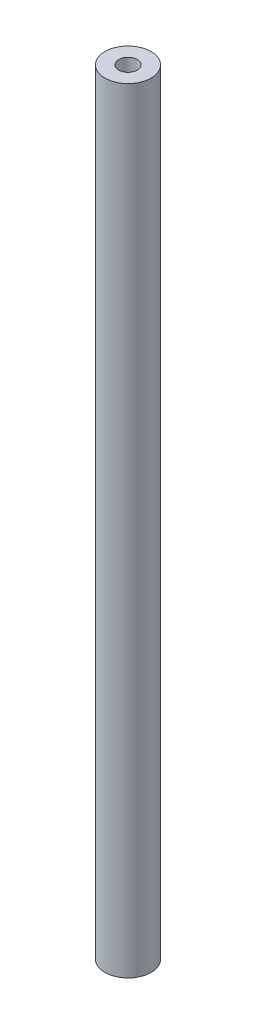
ISO-10303-21;
HEADER;
FILE_DESCRIPTION(('STEP AP214'),'2;1');
FILE_NAME('part.step','',(''),(''),'','','');
FILE_SCHEMA(('AUTOMOTIVE_DESIGN { 1 0 10303 214 1 1 1 1 }'));
ENDSEC;
DATA;
#1=APPLICATION_CONTEXT('core data for automotive mechanical design processes');
#2=APPLICATION_PROTOCOL_DEFINITION('international standard','automotive_design',2000,#1);
#3=PRODUCT_CONTEXT('',#1,'mechanical');
#4=PRODUCT('Part','Part','',(#3));
#5=PRODUCT_RELATED_PRODUCT_CATEGORY('part','',(#4));
#6=PRODUCT_DEFINITION_FORMATION('','',#4);
#7=PRODUCT_DEFINITION_CONTEXT('part definition',#1,'design');
#8=PRODUCT_DEFINITION('design','',#6,#7);
#9=PRODUCT_DEFINITION_SHAPE('','',#8);
#10=(LENGTH_UNIT() NAMED_UNIT(*) SI_UNIT(.MILLI.,.METRE.));
#11=(NAMED_UNIT(*) PLANE_ANGLE_UNIT() SI_UNIT($,.RADIAN.));
#12=(NAMED_UNIT(*) SI_UNIT($,.STERADIAN.) SOLID_ANGLE_UNIT());
#13=UNCERTAINTY_MEASURE_WITH_UNIT(LENGTH_MEASURE(1.E-05),#10,'distance_accuracy_value','');
#14=(GEOMETRIC_REPRESENTATION_CONTEXT(3) GLOBAL_UNCERTAINTY_ASSIGNED_CONTEXT((#13)) GLOBAL_UNIT_ASSIGNED_CONTEXT((#10,
#11,#12)) REPRESENTATION_CONTEXT('',''));
#15=CARTESIAN_POINT('',(0.,0.,0.));
#16=DIRECTION('',(0.,0.,1.));
#17=DIRECTION('',(1.,0.,0.));
#18=AXIS2_PLACEMENT_3D('',#15,#16,#17);
#19=CARTESIAN_POINT('',(0.,266.7,0.));
#20=DIRECTION('',(0.,1.,0.));
#21=DIRECTION('',(0.,0.,1.));
#22=AXIS2_PLACEMENT_3D('',#19,#20,#21);
#23=PLANE('',#22);
#24=CARTESIAN_POINT('',(0.,266.7,0.));
#25=DIRECTION('',(0.,1.,0.));
#26=DIRECTION('',(1.,0.,0.));
#27=AXIS2_PLACEMENT_3D('',#24,#25,#26);
#28=CIRCLE('',#27,7.9375);
#29=CARTESIAN_POINT('',(7.9375,266.7,0.));
#30=VERTEX_POINT('',#29);
#31=EDGE_CURVE('E10',#30,#30,#28,.T.);
#32=ORIENTED_EDGE('',*,*,#31,.T.);
#33=EDGE_LOOP('',(#32));
#34=FACE_BOUND('',#33,.T.);
#35=CARTESIAN_POINT('',(0.,266.7,0.));
#36=DIRECTION('',(0.,-1.,0.));
#37=DIRECTION('',(-1.,0.,0.));
#38=AXIS2_PLACEMENT_3D('',#35,#36,#37);
#39=CIRCLE('',#38,3.175);
#40=CARTESIAN_POINT('',(3.175,266.7,0.));
#41=VERTEX_POINT('',#40);
#42=EDGE_CURVE('E55',#41,#41,#39,.T.);
#43=ORIENTED_EDGE('',*,*,#42,.T.);
#44=EDGE_LOOP('',(#43));
#45=FACE_BOUND('',#44,.T.);
#46=ADVANCED_FACE('F15',(#34,#45),#23,.T.);
#47=CARTESIAN_POINT('',(0.,0.,0.));
#48=DIRECTION('',(0.,1.,0.));
#49=DIRECTION('',(0.,0.,1.));
#50=AXIS2_PLACEMENT_3D('',#47,#48,#49);
#51=PLANE('',#50);
#52=CARTESIAN_POINT('',(0.,0.,0.));
#53=DIRECTION('',(0.,-1.,0.));
#54=DIRECTION('',(1.,0.,0.));
#55=AXIS2_PLACEMENT_3D('',#52,#53,#54);
#56=CIRCLE('',#55,7.9375);
#57=CARTESIAN_POINT('',(7.9375,0.,0.));
#58=VERTEX_POINT('',#57);
#59=EDGE_CURVE('E25',#58,#58,#56,.T.);
#60=ORIENTED_EDGE('',*,*,#59,.T.);
#61=EDGE_LOOP('',(#60));
#62=FACE_BOUND('',#61,.T.);
#63=CARTESIAN_POINT('',(0.,0.,0.));
#64=DIRECTION('',(0.,1.,0.));
#65=DIRECTION('',(-1.,0.,0.));
#66=AXIS2_PLACEMENT_3D('',#63,#64,#65);
#67=CIRCLE('',#66,3.175);
#68=CARTESIAN_POINT('',(3.175,0.,0.));
#69=VERTEX_POINT('',#68);
#70=EDGE_CURVE('E64',#69,#69,#67,.T.);
#71=ORIENTED_EDGE('',*,*,#70,.T.);
#72=EDGE_LOOP('',(#71));
#73=FACE_BOUND('',#72,.T.);
#74=ADVANCED_FACE('F68',(#62,#73),#51,.F.);
#75=CARTESIAN_POINT('',(0.,0.,0.));
#76=DIRECTION('',(0.,-1.,0.));
#77=DIRECTION('',(1.,0.,0.));
#78=AXIS2_PLACEMENT_3D('',#75,#76,#77);
#79=CYLINDRICAL_SURFACE('',#78,7.9375);
#80=ORIENTED_EDGE('',*,*,#31,.F.);
#81=EDGE_LOOP('',(#80));
#82=FACE_BOUND('',#81,.T.);
#83=ORIENTED_EDGE('',*,*,#59,.F.);
#84=EDGE_LOOP('',(#83));
#85=FACE_BOUND('',#84,.T.);
#86=ADVANCED_FACE('F71',(#82,#85),#79,.T.);
#87=CARTESIAN_POINT('',(0.,0.,0.));
#88=DIRECTION('',(0.,-1.,0.));
#89=DIRECTION('',(1.,0.,0.));
#90=AXIS2_PLACEMENT_3D('',#87,#88,#89);
#91=CYLINDRICAL_SURFACE('',#90,6.2865);
#92=CARTESIAN_POINT('',(0.,254.,0.));
#93=DIRECTION('',(0.,1.,0.));
#94=DIRECTION('',(1.,0.,0.));
#95=AXIS2_PLACEMENT_3D('',#92,#93,#94);
#96=CIRCLE('',#95,6.2865);
#97=CARTESIAN_POINT('',(-6.2865,254.,0.));
#98=VERTEX_POINT('',#97);
#99=EDGE_CURVE('E59',#98,#98,#96,.T.);
#100=ORIENTED_EDGE('',*,*,#99,.T.);
#101=EDGE_LOOP('',(#100));
#102=FACE_BOUND('',#101,.T.);
#103=CARTESIAN_POINT('',(0.,12.7,0.));
#104=DIRECTION('',(0.,-1.,0.));
#105=DIRECTION('',(1.,0.,0.));
#106=AXIS2_PLACEMENT_3D('',#103,#104,#105);
#107=CIRCLE('',#106,6.2865);
#108=CARTESIAN_POINT('',(-6.2865,12.7,0.));
#109=VERTEX_POINT('',#108);
#110=EDGE_CURVE('E41',#109,#109,#107,.T.);
#111=ORIENTED_EDGE('',*,*,#110,.T.);
#112=EDGE_LOOP('',(#111));
#113=FACE_BOUND('',#112,.T.);
#114=ADVANCED_FACE('F60',(#102,#113),#91,.F.);
#115=CARTESIAN_POINT('',(0.,266.7,0.));
#116=DIRECTION('',(0.,1.,0.));
#117=DIRECTION('',(-1.,0.,0.));
#118=AXIS2_PLACEMENT_3D('',#115,#116,#117);
#119=CYLINDRICAL_SURFACE('',#118,3.175);
#120=ORIENTED_EDGE('',*,*,#42,.F.);
#121=EDGE_LOOP('',(#120));
#122=FACE_BOUND('',#121,.T.);
#123=CARTESIAN_POINT('',(0.,254.,0.));
#124=DIRECTION('',(0.,1.,0.));
#125=DIRECTION('',(-1.,0.,0.));
#126=AXIS2_PLACEMENT_3D('',#123,#124,#125);
#127=CIRCLE('',#126,3.175);
#128=CARTESIAN_POINT('',(3.175,254.,0.));
#129=VERTEX_POINT('',#128);
#130=EDGE_CURVE('E19',#129,#129,#127,.T.);
#131=ORIENTED_EDGE('',*,*,#130,.F.);
#132=EDGE_LOOP('',(#131));
#133=FACE_BOUND('',#132,.T.);
#134=ADVANCED_FACE('F80',(#122,#133),#119,.F.);
#135=CARTESIAN_POINT('',(0.,254.,0.));
#136=DIRECTION('',(0.,1.,0.));
#137=DIRECTION('',(0.,0.,1.));
#138=AXIS2_PLACEMENT_3D('',#135,#136,#137);
#139=PLANE('',#138);
#140=ORIENTED_EDGE('',*,*,#99,.F.);
#141=EDGE_LOOP('',(#140));
#142=FACE_BOUND('',#141,.T.);
#143=ORIENTED_EDGE('',*,*,#130,.T.);
#144=EDGE_LOOP('',(#143));
#145=FACE_BOUND('',#144,.T.);
#146=ADVANCED_FACE('F17',(#142,#145),#139,.F.);
#147=CARTESIAN_POINT('',(0.,0.,0.));
#148=DIRECTION('',(0.,-1.,0.));
#149=DIRECTION('',(-1.,0.,0.));
#150=AXIS2_PLACEMENT_3D('',#147,#148,#149);
#151=CYLINDRICAL_SURFACE('',#150,3.175);
#152=ORIENTED_EDGE('',*,*,#70,.F.);
#153=EDGE_LOOP('',(#152));
#154=FACE_BOUND('',#153,.T.);
#155=CARTESIAN_POINT('',(0.,12.7,0.));
#156=DIRECTION('',(0.,-1.,0.));
#157=DIRECTION('',(-1.,0.,0.));
#158=AXIS2_PLACEMENT_3D('',#155,#156,#157);
#159=CIRCLE('',#158,3.175);
#160=CARTESIAN_POINT('',(3.175,12.7,0.));
#161=VERTEX_POINT('',#160);
#162=EDGE_CURVE('E48',#161,#161,#159,.T.);
#163=ORIENTED_EDGE('',*,*,#162,.F.);
#164=EDGE_LOOP('',(#163));
#165=FACE_BOUND('',#164,.T.);
#166=ADVANCED_FACE('F88',(#154,#165),#151,.F.);
#167=CARTESIAN_POINT('',(0.,12.7,0.));
#168=DIRECTION('',(0.,1.,0.));
#169=DIRECTION('',(0.,0.,1.));
#170=AXIS2_PLACEMENT_3D('',#167,#168,#169);
#171=PLANE('',#170);
#172=ORIENTED_EDGE('',*,*,#110,.F.);
#173=EDGE_LOOP('',(#172));
#174=FACE_BOUND('',#173,.T.);
#175=ORIENTED_EDGE('',*,*,#162,.T.);
#176=EDGE_LOOP('',(#175));
#177=FACE_BOUND('',#176,.T.);
#178=ADVANCED_FACE('F101',(#174,#177),#171,.T.);
#179=CLOSED_SHELL('',(#46,#74,#86,#114,#134,#146,#166,#178));
#180=MANIFOLD_SOLID_BREP('B1',#179);
#181=ADVANCED_BREP_SHAPE_REPRESENTATION('',(#18,#180),#14);
#182=SHAPE_DEFINITION_REPRESENTATION(#9,#181);
ENDSEC;
END-ISO-10303-21;
